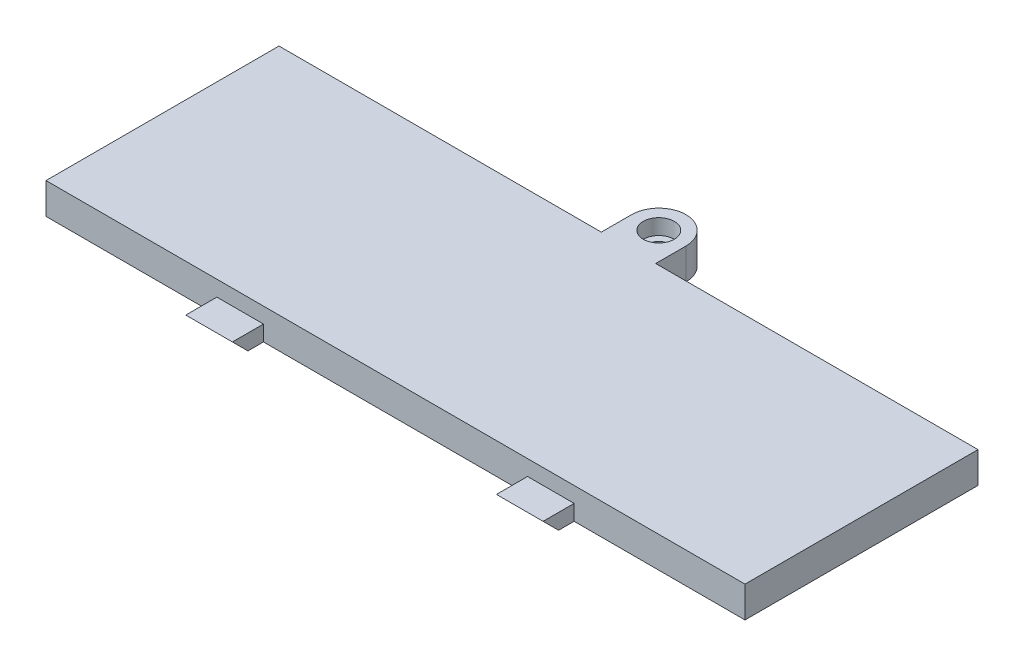
ISO-10303-21;
HEADER;
FILE_DESCRIPTION(('STEP AP214'),'2;1');
FILE_NAME('part.step','',(''),(''),'','','');
FILE_SCHEMA(('AUTOMOTIVE_DESIGN { 1 0 10303 214 1 1 1 1 }'));
ENDSEC;
DATA;
#1=APPLICATION_CONTEXT('core data for automotive mechanical design processes');
#2=APPLICATION_PROTOCOL_DEFINITION('international standard','automotive_design',2000,#1);
#3=PRODUCT_CONTEXT('',#1,'mechanical');
#4=PRODUCT('Part','Part','',(#3));
#5=PRODUCT_RELATED_PRODUCT_CATEGORY('part','',(#4));
#6=PRODUCT_DEFINITION_FORMATION('','',#4);
#7=PRODUCT_DEFINITION_CONTEXT('part definition',#1,'design');
#8=PRODUCT_DEFINITION('design','',#6,#7);
#9=PRODUCT_DEFINITION_SHAPE('','',#8);
#10=(LENGTH_UNIT() NAMED_UNIT(*) SI_UNIT(.MILLI.,.METRE.));
#11=(NAMED_UNIT(*) PLANE_ANGLE_UNIT() SI_UNIT($,.RADIAN.));
#12=(NAMED_UNIT(*) SI_UNIT($,.STERADIAN.) SOLID_ANGLE_UNIT());
#13=UNCERTAINTY_MEASURE_WITH_UNIT(LENGTH_MEASURE(1.E-05),#10,'distance_accuracy_value','');
#14=(GEOMETRIC_REPRESENTATION_CONTEXT(3) GLOBAL_UNCERTAINTY_ASSIGNED_CONTEXT((#13)) GLOBAL_UNIT_ASSIGNED_CONTEXT((#10,
#11,#12)) REPRESENTATION_CONTEXT('',''));
#15=CARTESIAN_POINT('',(0.,0.,0.));
#16=DIRECTION('',(0.,0.,1.));
#17=DIRECTION('',(1.,0.,0.));
#18=AXIS2_PLACEMENT_3D('',#15,#16,#17);
#19=CARTESIAN_POINT('',(0.,-0.00100000000000707,-18.9));
#20=DIRECTION('',(0.,1.,0.));
#21=DIRECTION('',(0.,0.,1.));
#22=AXIS2_PLACEMENT_3D('',#19,#20,#21);
#23=CYLINDRICAL_SURFACE('',#22,1.1);
#24=CARTESIAN_POINT('',(0.,0.,-18.9));
#25=DIRECTION('',(0.,1.,0.));
#26=DIRECTION('',(0.,0.,1.));
#27=AXIS2_PLACEMENT_3D('',#24,#25,#26);
#28=CIRCLE('',#27,1.1);
#29=CARTESIAN_POINT('',(0.,0.,-17.8));
#30=VERTEX_POINT('',#29);
#31=EDGE_CURVE('E432',#30,#30,#28,.F.);
#32=ORIENTED_EDGE('',*,*,#31,.T.);
#33=EDGE_LOOP('',(#32));
#34=FACE_BOUND('',#33,.T.);
#35=CARTESIAN_POINT('',(0.,2.,-18.9));
#36=DIRECTION('',(0.,1.,0.));
#37=DIRECTION('',(0.,0.,1.));
#38=AXIS2_PLACEMENT_3D('',#35,#36,#37);
#39=CIRCLE('',#38,1.1);
#40=CARTESIAN_POINT('',(0.,2.,-17.8));
#41=VERTEX_POINT('',#40);
#42=EDGE_CURVE('E126',#41,#41,#39,.F.);
#43=ORIENTED_EDGE('',*,*,#42,.F.);
#44=EDGE_LOOP('',(#43));
#45=FACE_BOUND('',#44,.T.);
#46=ADVANCED_FACE('F121',(#34,#45),#23,.F.);
#47=CARTESIAN_POINT('',(0.,4.,15.));
#48=DIRECTION('',(0.,0.,-1.));
#49=DIRECTION('',(-1.,0.,0.));
#50=AXIS2_PLACEMENT_3D('',#47,#48,#49);
#51=PLANE('',#50);
#52=DIRECTION('',(0.,1.,0.));
#53=VECTOR('',#52,1.);
#54=CARTESIAN_POINT('',(23.,0.,15.));
#55=LINE('',#54,#53);
#56=CARTESIAN_POINT('',(23.,0.,15.));
#57=VERTEX_POINT('',#56);
#58=CARTESIAN_POINT('',(23.,1.99999999999999,15.));
#59=VERTEX_POINT('',#58);
#60=EDGE_CURVE('E262',#57,#59,#55,.T.);
#61=ORIENTED_EDGE('',*,*,#60,.F.);
#62=DIRECTION('',(1.,0.,0.));
#63=VECTOR('',#62,1.);
#64=CARTESIAN_POINT('',(0.,0.,15.));
#65=LINE('',#64,#63);
#66=CARTESIAN_POINT('',(45.,0.,15.));
#67=VERTEX_POINT('',#66);
#68=EDGE_CURVE('E347',#57,#67,#65,.T.);
#69=ORIENTED_EDGE('',*,*,#68,.T.);
#70=DIRECTION('',(0.,-1.,0.));
#71=VECTOR('',#70,1.);
#72=CARTESIAN_POINT('',(45.,4.,15.));
#73=LINE('',#72,#71);
#74=CARTESIAN_POINT('',(45.,4.,15.));
#75=VERTEX_POINT('',#74);
#76=EDGE_CURVE('E325',#75,#67,#73,.T.);
#77=ORIENTED_EDGE('',*,*,#76,.F.);
#78=DIRECTION('',(1.,0.,0.));
#79=VECTOR('',#78,1.);
#80=CARTESIAN_POINT('',(0.,4.,15.));
#81=LINE('',#80,#79);
#82=CARTESIAN_POINT('',(-45.,4.,15.));
#83=VERTEX_POINT('',#82);
#84=EDGE_CURVE('E322',#83,#75,#81,.T.);
#85=ORIENTED_EDGE('',*,*,#84,.F.);
#86=DIRECTION('',(0.,-1.,0.));
#87=VECTOR('',#86,1.);
#88=CARTESIAN_POINT('',(-45.,4.,15.));
#89=LINE('',#88,#87);
#90=CARTESIAN_POINT('',(-45.,0.,15.));
#91=VERTEX_POINT('',#90);
#92=EDGE_CURVE('E355',#83,#91,#89,.T.);
#93=ORIENTED_EDGE('',*,*,#92,.T.);
#94=CARTESIAN_POINT('',(-23.,0.,15.));
#95=VERTEX_POINT('',#94);
#96=EDGE_CURVE('E306',#91,#95,#65,.T.);
#97=ORIENTED_EDGE('',*,*,#96,.T.);
#98=DIRECTION('',(0.,-1.,0.));
#99=VECTOR('',#98,1.);
#100=CARTESIAN_POINT('',(-23.,0.,15.));
#101=LINE('',#100,#99);
#102=CARTESIAN_POINT('',(-23.,2.,15.));
#103=VERTEX_POINT('',#102);
#104=EDGE_CURVE('E264',#103,#95,#101,.T.);
#105=ORIENTED_EDGE('',*,*,#104,.F.);
#106=DIRECTION('',(-1.,0.,0.));
#107=VECTOR('',#106,1.);
#108=CARTESIAN_POINT('',(-23.,2.,15.));
#109=LINE('',#108,#107);
#110=CARTESIAN_POINT('',(-17.,2.,15.));
#111=VERTEX_POINT('',#110);
#112=EDGE_CURVE('E279',#111,#103,#109,.T.);
#113=ORIENTED_EDGE('',*,*,#112,.F.);
#114=DIRECTION('',(0.,1.,0.));
#115=VECTOR('',#114,1.);
#116=CARTESIAN_POINT('',(-17.,0.,15.));
#117=LINE('',#116,#115);
#118=CARTESIAN_POINT('',(-17.,0.,15.));
#119=VERTEX_POINT('',#118);
#120=EDGE_CURVE('E269',#119,#111,#117,.T.);
#121=ORIENTED_EDGE('',*,*,#120,.F.);
#122=CARTESIAN_POINT('',(17.,0.,15.));
#123=VERTEX_POINT('',#122);
#124=EDGE_CURVE('E351',#119,#123,#65,.T.);
#125=ORIENTED_EDGE('',*,*,#124,.T.);
#126=DIRECTION('',(0.,-1.,0.));
#127=VECTOR('',#126,1.);
#128=CARTESIAN_POINT('',(17.,0.,15.));
#129=LINE('',#128,#127);
#130=CARTESIAN_POINT('',(17.,2.,15.));
#131=VERTEX_POINT('',#130);
#132=EDGE_CURVE('E258',#131,#123,#129,.T.);
#133=ORIENTED_EDGE('',*,*,#132,.F.);
#134=DIRECTION('',(-1.,0.,0.));
#135=VECTOR('',#134,1.);
#136=CARTESIAN_POINT('',(23.,1.99999999999999,15.));
#137=LINE('',#136,#135);
#138=EDGE_CURVE('E430',#59,#131,#137,.T.);
#139=ORIENTED_EDGE('',*,*,#138,.F.);
#140=EDGE_LOOP('',(#61,#69,#77,#85,#93,#97,#105,#113,#121,#125,#133,#139));
#141=FACE_BOUND('',#140,.T.);
#142=ADVANCED_FACE('F429',(#141),#51,.F.);
#143=CARTESIAN_POINT('',(0.,0.,0.));
#144=DIRECTION('',(0.,1.,0.));
#145=DIRECTION('',(0.,0.,1.));
#146=AXIS2_PLACEMENT_3D('',#143,#144,#145);
#147=PLANE('',#146);
#148=ORIENTED_EDGE('',*,*,#31,.F.);
#149=EDGE_LOOP('',(#148));
#150=FACE_BOUND('',#149,.T.);
#151=DIRECTION('',(0.,0.,-1.));
#152=VECTOR('',#151,1.);
#153=CARTESIAN_POINT('',(23.,0.,19.));
#154=LINE('',#153,#152);
#155=CARTESIAN_POINT('',(23.,0.,17.));
#156=VERTEX_POINT('',#155);
#157=EDGE_CURVE('E257',#156,#57,#154,.T.);
#158=ORIENTED_EDGE('',*,*,#157,.F.);
#159=DIRECTION('',(-1.,0.,0.));
#160=VECTOR('',#159,1.);
#161=CARTESIAN_POINT('',(17.,0.,17.));
#162=LINE('',#161,#160);
#163=CARTESIAN_POINT('',(17.,0.,17.));
#164=VERTEX_POINT('',#163);
#165=EDGE_CURVE('E240',#156,#164,#162,.T.);
#166=ORIENTED_EDGE('',*,*,#165,.T.);
#167=DIRECTION('',(0.,0.,-1.));
#168=VECTOR('',#167,1.);
#169=CARTESIAN_POINT('',(17.,0.,19.));
#170=LINE('',#169,#168);
#171=EDGE_CURVE('E271',#164,#123,#170,.T.);
#172=ORIENTED_EDGE('',*,*,#171,.T.);
#173=ORIENTED_EDGE('',*,*,#124,.F.);
#174=DIRECTION('',(0.,0.,-1.));
#175=VECTOR('',#174,1.);
#176=CARTESIAN_POINT('',(-17.,0.,19.));
#177=LINE('',#176,#175);
#178=CARTESIAN_POINT('',(-17.,0.,17.));
#179=VERTEX_POINT('',#178);
#180=EDGE_CURVE('E294',#179,#119,#177,.T.);
#181=ORIENTED_EDGE('',*,*,#180,.F.);
#182=DIRECTION('',(-1.,0.,0.));
#183=VECTOR('',#182,1.);
#184=CARTESIAN_POINT('',(0.,0.,17.));
#185=LINE('',#184,#183);
#186=CARTESIAN_POINT('',(-23.,0.,17.));
#187=VERTEX_POINT('',#186);
#188=EDGE_CURVE('E139',#179,#187,#185,.T.);
#189=ORIENTED_EDGE('',*,*,#188,.T.);
#190=DIRECTION('',(0.,0.,-1.));
#191=VECTOR('',#190,1.);
#192=CARTESIAN_POINT('',(-23.,0.,19.));
#193=LINE('',#192,#191);
#194=EDGE_CURVE('E297',#187,#95,#193,.T.);
#195=ORIENTED_EDGE('',*,*,#194,.T.);
#196=ORIENTED_EDGE('',*,*,#96,.F.);
#197=DIRECTION('',(0.,0.,1.));
#198=VECTOR('',#197,1.);
#199=CARTESIAN_POINT('',(-45.,0.,0.));
#200=LINE('',#199,#198);
#201=CARTESIAN_POINT('',(-45.,0.,-15.));
#202=VERTEX_POINT('',#201);
#203=EDGE_CURVE('E344',#202,#91,#200,.T.);
#204=ORIENTED_EDGE('',*,*,#203,.F.);
#205=DIRECTION('',(1.,0.,0.));
#206=VECTOR('',#205,1.);
#207=CARTESIAN_POINT('',(0.,0.,-15.));
#208=LINE('',#207,#206);
#209=CARTESIAN_POINT('',(-3.5,0.,-15.));
#210=VERTEX_POINT('',#209);
#211=EDGE_CURVE('E336',#202,#210,#208,.T.);
#212=ORIENTED_EDGE('',*,*,#211,.T.);
#213=DIRECTION('',(0.,0.,1.));
#214=VECTOR('',#213,1.);
#215=CARTESIAN_POINT('',(-3.5,0.,0.));
#216=LINE('',#215,#214);
#217=CARTESIAN_POINT('',(-3.5,0.,-18.9));
#218=VERTEX_POINT('',#217);
#219=EDGE_CURVE('E340',#218,#210,#216,.T.);
#220=ORIENTED_EDGE('',*,*,#219,.F.);
#221=CARTESIAN_POINT('',(0.,0.,-18.9));
#222=DIRECTION('',(0.,1.,0.));
#223=DIRECTION('',(0.,0.,1.));
#224=AXIS2_PLACEMENT_3D('',#221,#222,#223);
#225=CIRCLE('',#224,3.5);
#226=CARTESIAN_POINT('',(3.5,0.,-18.9));
#227=VERTEX_POINT('',#226);
#228=EDGE_CURVE('E300',#227,#218,#225,.T.);
#229=ORIENTED_EDGE('',*,*,#228,.F.);
#230=DIRECTION('',(0.,0.,1.));
#231=VECTOR('',#230,1.);
#232=CARTESIAN_POINT('',(3.5,0.,0.));
#233=LINE('',#232,#231);
#234=CARTESIAN_POINT('',(3.5,0.,-15.));
#235=VERTEX_POINT('',#234);
#236=EDGE_CURVE('E335',#227,#235,#233,.T.);
#237=ORIENTED_EDGE('',*,*,#236,.T.);
#238=CARTESIAN_POINT('',(45.,0.,-15.));
#239=VERTEX_POINT('',#238);
#240=EDGE_CURVE('E330',#235,#239,#208,.T.);
#241=ORIENTED_EDGE('',*,*,#240,.T.);
#242=DIRECTION('',(0.,0.,1.));
#243=VECTOR('',#242,1.);
#244=CARTESIAN_POINT('',(45.,0.,0.));
#245=LINE('',#244,#243);
#246=EDGE_CURVE('E326',#239,#67,#245,.T.);
#247=ORIENTED_EDGE('',*,*,#246,.T.);
#248=ORIENTED_EDGE('',*,*,#68,.F.);
#249=EDGE_LOOP('',(#158,#166,#172,#173,#181,#189,#195,#196,#204,#212,#220,#229,#237,#241,#247,#248));
#250=FACE_BOUND('',#249,.T.);
#251=ADVANCED_FACE('F400',(#150,#250),#147,.F.);
#252=CARTESIAN_POINT('',(3.5,4.,0.));
#253=DIRECTION('',(1.,0.,0.));
#254=DIRECTION('',(0.,0.,-1.));
#255=AXIS2_PLACEMENT_3D('',#252,#253,#254);
#256=PLANE('',#255);
#257=ORIENTED_EDGE('',*,*,#236,.F.);
#258=DIRECTION('',(0.,-1.,0.));
#259=VECTOR('',#258,1.);
#260=CARTESIAN_POINT('',(3.5,4.,-18.9));
#261=LINE('',#260,#259);
#262=CARTESIAN_POINT('',(3.5,4.,-18.9));
#263=VERTEX_POINT('',#262);
#264=EDGE_CURVE('E368',#263,#227,#261,.T.);
#265=ORIENTED_EDGE('',*,*,#264,.F.);
#266=DIRECTION('',(0.,0.,1.));
#267=VECTOR('',#266,1.);
#268=CARTESIAN_POINT('',(3.5,4.,0.));
#269=LINE('',#268,#267);
#270=CARTESIAN_POINT('',(3.5,4.,-15.));
#271=VERTEX_POINT('',#270);
#272=EDGE_CURVE('E310',#263,#271,#269,.T.);
#273=ORIENTED_EDGE('',*,*,#272,.T.);
#274=DIRECTION('',(0.,-1.,0.));
#275=VECTOR('',#274,1.);
#276=CARTESIAN_POINT('',(3.5,4.,-15.));
#277=LINE('',#276,#275);
#278=EDGE_CURVE('E371',#271,#235,#277,.T.);
#279=ORIENTED_EDGE('',*,*,#278,.T.);
#280=EDGE_LOOP('',(#257,#265,#273,#279));
#281=FACE_BOUND('',#280,.T.);
#282=ADVANCED_FACE('F415',(#281),#256,.T.);
#283=CARTESIAN_POINT('',(-3.5,4.,0.));
#284=DIRECTION('',(1.,0.,0.));
#285=DIRECTION('',(0.,0.,-1.));
#286=AXIS2_PLACEMENT_3D('',#283,#284,#285);
#287=PLANE('',#286);
#288=ORIENTED_EDGE('',*,*,#219,.T.);
#289=DIRECTION('',(0.,-1.,0.));
#290=VECTOR('',#289,1.);
#291=CARTESIAN_POINT('',(-3.5,4.,-15.));
#292=LINE('',#291,#290);
#293=CARTESIAN_POINT('',(-3.5,4.,-15.));
#294=VERTEX_POINT('',#293);
#295=EDGE_CURVE('E362',#294,#210,#292,.T.);
#296=ORIENTED_EDGE('',*,*,#295,.F.);
#297=DIRECTION('',(0.,0.,1.));
#298=VECTOR('',#297,1.);
#299=CARTESIAN_POINT('',(-3.5,4.,0.));
#300=LINE('',#299,#298);
#301=CARTESIAN_POINT('',(-3.5,4.,-18.9));
#302=VERTEX_POINT('',#301);
#303=EDGE_CURVE('E315',#302,#294,#300,.T.);
#304=ORIENTED_EDGE('',*,*,#303,.F.);
#305=DIRECTION('',(0.,-1.,0.));
#306=VECTOR('',#305,1.);
#307=CARTESIAN_POINT('',(-3.5,4.,-18.9));
#308=LINE('',#307,#306);
#309=EDGE_CURVE('E365',#302,#218,#308,.T.);
#310=ORIENTED_EDGE('',*,*,#309,.T.);
#311=EDGE_LOOP('',(#288,#296,#304,#310));
#312=FACE_BOUND('',#311,.T.);
#313=ADVANCED_FACE('F409',(#312),#287,.F.);
#314=CARTESIAN_POINT('',(0.,4.,0.));
#315=DIRECTION('',(0.,1.,0.));
#316=DIRECTION('',(0.,0.,1.));
#317=AXIS2_PLACEMENT_3D('',#314,#315,#316);
#318=PLANE('',#317);
#319=CARTESIAN_POINT('',(0.,4.,-18.9));
#320=DIRECTION('',(0.,1.,0.));
#321=DIRECTION('',(0.,0.,1.));
#322=AXIS2_PLACEMENT_3D('',#319,#320,#321);
#323=CIRCLE('',#322,2.);
#324=CARTESIAN_POINT('',(0.,4.,-16.9));
#325=VERTEX_POINT('',#324);
#326=EDGE_CURVE('E486',#325,#325,#323,.T.);
#327=ORIENTED_EDGE('',*,*,#326,.F.);
#328=EDGE_LOOP('',(#327));
#329=FACE_BOUND('',#328,.T.);
#330=ORIENTED_EDGE('',*,*,#303,.T.);
#331=DIRECTION('',(1.,0.,0.));
#332=VECTOR('',#331,1.);
#333=CARTESIAN_POINT('',(0.,4.,-15.));
#334=LINE('',#333,#332);
#335=CARTESIAN_POINT('',(-45.,4.,-15.));
#336=VERTEX_POINT('',#335);
#337=EDGE_CURVE('E311',#336,#294,#334,.T.);
#338=ORIENTED_EDGE('',*,*,#337,.F.);
#339=DIRECTION('',(0.,0.,1.));
#340=VECTOR('',#339,1.);
#341=CARTESIAN_POINT('',(-45.,4.,0.));
#342=LINE('',#341,#340);
#343=EDGE_CURVE('E319',#336,#83,#342,.T.);
#344=ORIENTED_EDGE('',*,*,#343,.T.);
#345=ORIENTED_EDGE('',*,*,#84,.T.);
#346=DIRECTION('',(0.,0.,1.));
#347=VECTOR('',#346,1.);
#348=CARTESIAN_POINT('',(45.,4.,0.));
#349=LINE('',#348,#347);
#350=CARTESIAN_POINT('',(45.,4.,-15.));
#351=VERTEX_POINT('',#350);
#352=EDGE_CURVE('E301',#351,#75,#349,.T.);
#353=ORIENTED_EDGE('',*,*,#352,.F.);
#354=EDGE_CURVE('E305',#271,#351,#334,.T.);
#355=ORIENTED_EDGE('',*,*,#354,.F.);
#356=ORIENTED_EDGE('',*,*,#272,.F.);
#357=CARTESIAN_POINT('',(0.,4.,-18.9));
#358=DIRECTION('',(0.,1.,0.));
#359=DIRECTION('',(0.,0.,1.));
#360=AXIS2_PLACEMENT_3D('',#357,#358,#359);
#361=CIRCLE('',#360,3.5);
#362=EDGE_CURVE('E331',#263,#302,#361,.T.);
#363=ORIENTED_EDGE('',*,*,#362,.T.);
#364=EDGE_LOOP('',(#330,#338,#344,#345,#353,#355,#356,#363));
#365=FACE_BOUND('',#364,.T.);
#366=ADVANCED_FACE('F494',(#329,#365),#318,.T.);
#367=CARTESIAN_POINT('',(-45.,4.,0.));
#368=DIRECTION('',(1.,0.,0.));
#369=DIRECTION('',(0.,0.,-1.));
#370=AXIS2_PLACEMENT_3D('',#367,#368,#369);
#371=PLANE('',#370);
#372=ORIENTED_EDGE('',*,*,#203,.T.);
#373=ORIENTED_EDGE('',*,*,#92,.F.);
#374=ORIENTED_EDGE('',*,*,#343,.F.);
#375=DIRECTION('',(0.,-1.,0.));
#376=VECTOR('',#375,1.);
#377=CARTESIAN_POINT('',(-45.,4.,-15.));
#378=LINE('',#377,#376);
#379=EDGE_CURVE('E359',#336,#202,#378,.T.);
#380=ORIENTED_EDGE('',*,*,#379,.T.);
#381=EDGE_LOOP('',(#372,#373,#374,#380));
#382=FACE_BOUND('',#381,.T.);
#383=ADVANCED_FACE('F464',(#382),#371,.F.);
#384=CARTESIAN_POINT('',(45.,4.,0.));
#385=DIRECTION('',(1.,0.,0.));
#386=DIRECTION('',(0.,0.,-1.));
#387=AXIS2_PLACEMENT_3D('',#384,#385,#386);
#388=PLANE('',#387);
#389=ORIENTED_EDGE('',*,*,#246,.F.);
#390=DIRECTION('',(0.,-1.,0.));
#391=VECTOR('',#390,1.);
#392=CARTESIAN_POINT('',(45.,4.,-15.));
#393=LINE('',#392,#391);
#394=EDGE_CURVE('E245',#351,#239,#393,.T.);
#395=ORIENTED_EDGE('',*,*,#394,.F.);
#396=ORIENTED_EDGE('',*,*,#352,.T.);
#397=ORIENTED_EDGE('',*,*,#76,.T.);
#398=EDGE_LOOP('',(#389,#395,#396,#397));
#399=FACE_BOUND('',#398,.T.);
#400=ADVANCED_FACE('F424',(#399),#388,.T.);
#401=CARTESIAN_POINT('',(0.,4.,-15.));
#402=DIRECTION('',(0.,0.,-1.));
#403=DIRECTION('',(-1.,0.,0.));
#404=AXIS2_PLACEMENT_3D('',#401,#402,#403);
#405=PLANE('',#404);
#406=ORIENTED_EDGE('',*,*,#240,.F.);
#407=ORIENTED_EDGE('',*,*,#278,.F.);
#408=ORIENTED_EDGE('',*,*,#354,.T.);
#409=ORIENTED_EDGE('',*,*,#394,.T.);
#410=EDGE_LOOP('',(#406,#407,#408,#409));
#411=FACE_BOUND('',#410,.T.);
#412=ADVANCED_FACE('F420',(#411),#405,.T.);
#413=ORIENTED_EDGE('',*,*,#211,.F.);
#414=ORIENTED_EDGE('',*,*,#379,.F.);
#415=ORIENTED_EDGE('',*,*,#337,.T.);
#416=ORIENTED_EDGE('',*,*,#295,.T.);
#417=EDGE_LOOP('',(#413,#414,#415,#416));
#418=FACE_BOUND('',#417,.T.);
#419=ADVANCED_FACE('F404',(#418),#405,.T.);
#420=CARTESIAN_POINT('',(0.,4.,-18.9));
#421=DIRECTION('',(0.,-1.,0.));
#422=DIRECTION('',(0.,0.,-1.));
#423=AXIS2_PLACEMENT_3D('',#420,#421,#422);
#424=CYLINDRICAL_SURFACE('',#423,3.5);
#425=ORIENTED_EDGE('',*,*,#264,.T.);
#426=ORIENTED_EDGE('',*,*,#228,.T.);
#427=ORIENTED_EDGE('',*,*,#309,.F.);
#428=ORIENTED_EDGE('',*,*,#362,.F.);
#429=EDGE_LOOP('',(#425,#426,#427,#428));
#430=FACE_BOUND('',#429,.T.);
#431=ADVANCED_FACE('F412',(#430),#424,.T.);
#432=CARTESIAN_POINT('',(-23.,0.,19.));
#433=DIRECTION('',(1.,0.,0.));
#434=DIRECTION('',(0.,0.,-1.));
#435=AXIS2_PLACEMENT_3D('',#432,#433,#434);
#436=PLANE('',#435);
#437=ORIENTED_EDGE('',*,*,#194,.F.);
#438=DIRECTION('',(0.,-0.707106781186545,-0.70710678118655));
#439=VECTOR('',#438,1.);
#440=CARTESIAN_POINT('',(-23.,2.00000000000002,19.));
#441=LINE('',#440,#439);
#442=CARTESIAN_POINT('',(-23.,2.,19.));
#443=VERTEX_POINT('',#442);
#444=EDGE_CURVE('E12',#187,#443,#441,.F.);
#445=ORIENTED_EDGE('',*,*,#444,.T.);
#446=DIRECTION('',(0.,0.,-1.));
#447=VECTOR('',#446,1.);
#448=CARTESIAN_POINT('',(-23.,2.,19.));
#449=LINE('',#448,#447);
#450=EDGE_CURVE('E278',#443,#103,#449,.T.);
#451=ORIENTED_EDGE('',*,*,#450,.T.);
#452=ORIENTED_EDGE('',*,*,#104,.T.);
#453=EDGE_LOOP('',(#437,#445,#451,#452));
#454=FACE_BOUND('',#453,.T.);
#455=ADVANCED_FACE('F498',(#454),#436,.F.);
#456=CARTESIAN_POINT('',(-17.,0.,19.));
#457=DIRECTION('',(-1.,0.,0.));
#458=DIRECTION('',(0.,0.,1.));
#459=AXIS2_PLACEMENT_3D('',#456,#457,#458);
#460=PLANE('',#459);
#461=DIRECTION('',(0.,0.,-1.));
#462=VECTOR('',#461,1.);
#463=CARTESIAN_POINT('',(-17.,2.,19.));
#464=LINE('',#463,#462);
#465=CARTESIAN_POINT('',(-17.,2.,19.));
#466=VERTEX_POINT('',#465);
#467=EDGE_CURVE('E290',#466,#111,#464,.T.);
#468=ORIENTED_EDGE('',*,*,#467,.F.);
#469=DIRECTION('',(0.,0.707106781186545,0.70710678118655));
#470=VECTOR('',#469,1.);
#471=CARTESIAN_POINT('',(-17.,2.00000000000002,19.));
#472=LINE('',#471,#470);
#473=EDGE_CURVE('E132',#466,#179,#472,.F.);
#474=ORIENTED_EDGE('',*,*,#473,.T.);
#475=ORIENTED_EDGE('',*,*,#180,.T.);
#476=ORIENTED_EDGE('',*,*,#120,.T.);
#477=EDGE_LOOP('',(#468,#474,#475,#476));
#478=FACE_BOUND('',#477,.T.);
#479=ADVANCED_FACE('F507',(#478),#460,.F.);
#480=CARTESIAN_POINT('',(-23.,2.,19.));
#481=DIRECTION('',(0.,-1.,0.));
#482=DIRECTION('',(1.,0.,0.));
#483=AXIS2_PLACEMENT_3D('',#480,#481,#482);
#484=PLANE('',#483);
#485=ORIENTED_EDGE('',*,*,#112,.T.);
#486=ORIENTED_EDGE('',*,*,#450,.F.);
#487=DIRECTION('',(-1.,0.,0.));
#488=VECTOR('',#487,1.);
#489=CARTESIAN_POINT('',(-23.,2.,19.));
#490=LINE('',#489,#488);
#491=EDGE_CURVE('E275',#466,#443,#490,.T.);
#492=ORIENTED_EDGE('',*,*,#491,.F.);
#493=ORIENTED_EDGE('',*,*,#467,.T.);
#494=EDGE_LOOP('',(#485,#486,#492,#493));
#495=FACE_BOUND('',#494,.T.);
#496=ADVANCED_FACE('F506',(#495),#484,.F.);
#497=CARTESIAN_POINT('',(23.,0.,19.));
#498=DIRECTION('',(-1.,0.,0.));
#499=DIRECTION('',(0.,0.,1.));
#500=AXIS2_PLACEMENT_3D('',#497,#498,#499);
#501=PLANE('',#500);
#502=DIRECTION('',(0.,0.,-1.));
#503=VECTOR('',#502,1.);
#504=CARTESIAN_POINT('',(23.,1.99999999999999,19.));
#505=LINE('',#504,#503);
#506=CARTESIAN_POINT('',(23.,1.99999999999999,19.));
#507=VERTEX_POINT('',#506);
#508=EDGE_CURVE('E252',#507,#59,#505,.T.);
#509=ORIENTED_EDGE('',*,*,#508,.F.);
#510=DIRECTION('',(0.,-0.707106781186548,-0.707106781186548));
#511=VECTOR('',#510,1.);
#512=CARTESIAN_POINT('',(23.,2.,19.));
#513=LINE('',#512,#511);
#514=EDGE_CURVE('E235',#507,#156,#513,.T.);
#515=ORIENTED_EDGE('',*,*,#514,.T.);
#516=ORIENTED_EDGE('',*,*,#157,.T.);
#517=ORIENTED_EDGE('',*,*,#60,.T.);
#518=EDGE_LOOP('',(#509,#515,#516,#517));
#519=FACE_BOUND('',#518,.T.);
#520=ADVANCED_FACE('F260',(#519),#501,.F.);
#521=CARTESIAN_POINT('',(23.,1.99999999999999,19.));
#522=DIRECTION('',(0.,-1.,0.));
#523=DIRECTION('',(1.,0.,0.));
#524=AXIS2_PLACEMENT_3D('',#521,#522,#523);
#525=PLANE('',#524);
#526=ORIENTED_EDGE('',*,*,#138,.T.);
#527=DIRECTION('',(0.,0.,-1.));
#528=VECTOR('',#527,1.);
#529=CARTESIAN_POINT('',(17.,2.,19.));
#530=LINE('',#529,#528);
#531=CARTESIAN_POINT('',(17.,2.,19.));
#532=VERTEX_POINT('',#531);
#533=EDGE_CURVE('E255',#532,#131,#530,.T.);
#534=ORIENTED_EDGE('',*,*,#533,.F.);
#535=DIRECTION('',(-1.,0.,0.));
#536=VECTOR('',#535,1.);
#537=CARTESIAN_POINT('',(23.,1.99999999999999,19.));
#538=LINE('',#537,#536);
#539=EDGE_CURVE('E239',#507,#532,#538,.T.);
#540=ORIENTED_EDGE('',*,*,#539,.F.);
#541=ORIENTED_EDGE('',*,*,#508,.T.);
#542=EDGE_LOOP('',(#526,#534,#540,#541));
#543=FACE_BOUND('',#542,.T.);
#544=ADVANCED_FACE('F251',(#543),#525,.F.);
#545=CARTESIAN_POINT('',(17.,0.,19.));
#546=DIRECTION('',(1.,0.,0.));
#547=DIRECTION('',(0.,0.,-1.));
#548=AXIS2_PLACEMENT_3D('',#545,#546,#547);
#549=PLANE('',#548);
#550=ORIENTED_EDGE('',*,*,#171,.F.);
#551=DIRECTION('',(0.,0.707106781186548,0.707106781186548));
#552=VECTOR('',#551,1.);
#553=CARTESIAN_POINT('',(17.,2.,19.));
#554=LINE('',#553,#552);
#555=EDGE_CURVE('E386',#164,#532,#554,.T.);
#556=ORIENTED_EDGE('',*,*,#555,.T.);
#557=ORIENTED_EDGE('',*,*,#533,.T.);
#558=ORIENTED_EDGE('',*,*,#132,.T.);
#559=EDGE_LOOP('',(#550,#556,#557,#558));
#560=FACE_BOUND('',#559,.T.);
#561=ADVANCED_FACE('F449',(#560),#549,.F.);
#562=CARTESIAN_POINT('',(0.,2.,19.));
#563=DIRECTION('',(0.,-0.707106781186547,0.707106781186547));
#564=DIRECTION('',(-1.,0.,0.));
#565=AXIS2_PLACEMENT_3D('',#562,#563,#564);
#566=PLANE('',#565);
#567=ORIENTED_EDGE('',*,*,#555,.F.);
#568=ORIENTED_EDGE('',*,*,#165,.F.);
#569=ORIENTED_EDGE('',*,*,#514,.F.);
#570=ORIENTED_EDGE('',*,*,#539,.T.);
#571=EDGE_LOOP('',(#567,#568,#569,#570));
#572=FACE_BOUND('',#571,.T.);
#573=ADVANCED_FACE('F238',(#572),#566,.T.);
#574=CARTESIAN_POINT('',(0.,2.00000000000002,19.));
#575=DIRECTION('',(0.,0.70710678118655,-0.707106781186545));
#576=DIRECTION('',(1.,0.,0.));
#577=AXIS2_PLACEMENT_3D('',#574,#575,#576);
#578=PLANE('',#577);
#579=ORIENTED_EDGE('',*,*,#444,.F.);
#580=ORIENTED_EDGE('',*,*,#188,.F.);
#581=ORIENTED_EDGE('',*,*,#473,.F.);
#582=ORIENTED_EDGE('',*,*,#491,.T.);
#583=EDGE_LOOP('',(#579,#580,#581,#582));
#584=FACE_BOUND('',#583,.T.);
#585=ADVANCED_FACE('F124',(#584),#578,.F.);
#586=CARTESIAN_POINT('',(0.,2.,-18.9));
#587=DIRECTION('',(0.,1.,0.));
#588=DIRECTION('',(0.,0.,1.));
#589=AXIS2_PLACEMENT_3D('',#586,#587,#588);
#590=PLANE('',#589);
#591=CARTESIAN_POINT('',(0.,2.,-18.9));
#592=DIRECTION('',(0.,1.,0.));
#593=DIRECTION('',(0.,0.,1.));
#594=AXIS2_PLACEMENT_3D('',#591,#592,#593);
#595=CIRCLE('',#594,2.);
#596=CARTESIAN_POINT('',(0.,2.,-16.9));
#597=VERTEX_POINT('',#596);
#598=EDGE_CURVE('E481',#597,#597,#595,.T.);
#599=ORIENTED_EDGE('',*,*,#598,.T.);
#600=EDGE_LOOP('',(#599));
#601=FACE_BOUND('',#600,.T.);
#602=ORIENTED_EDGE('',*,*,#42,.T.);
#603=EDGE_LOOP('',(#602));
#604=FACE_BOUND('',#603,.T.);
#605=ADVANCED_FACE('F470',(#601,#604),#590,.T.);
#606=CARTESIAN_POINT('',(0.,2.,-18.9));
#607=DIRECTION('',(0.,1.,0.));
#608=DIRECTION('',(0.,0.,1.));
#609=AXIS2_PLACEMENT_3D('',#606,#607,#608);
#610=CYLINDRICAL_SURFACE('',#609,2.);
#611=ORIENTED_EDGE('',*,*,#598,.F.);
#612=EDGE_LOOP('',(#611));
#613=FACE_BOUND('',#612,.T.);
#614=ORIENTED_EDGE('',*,*,#326,.T.);
#615=EDGE_LOOP('',(#614));
#616=FACE_BOUND('',#615,.T.);
#617=ADVANCED_FACE('F467',(#613,#616),#610,.F.);
#618=CLOSED_SHELL('',(#46,#142,#251,#282,#313,#366,#383,#400,#412,#419,#431,#455,#479,#496,#520,
#544,#561,#573,#585,#605,#617));
#619=MANIFOLD_SOLID_BREP('B2',#618);
#620=ADVANCED_BREP_SHAPE_REPRESENTATION('',(#18,#619),#14);
#621=SHAPE_DEFINITION_REPRESENTATION(#9,#620);
ENDSEC;
END-ISO-10303-21;
